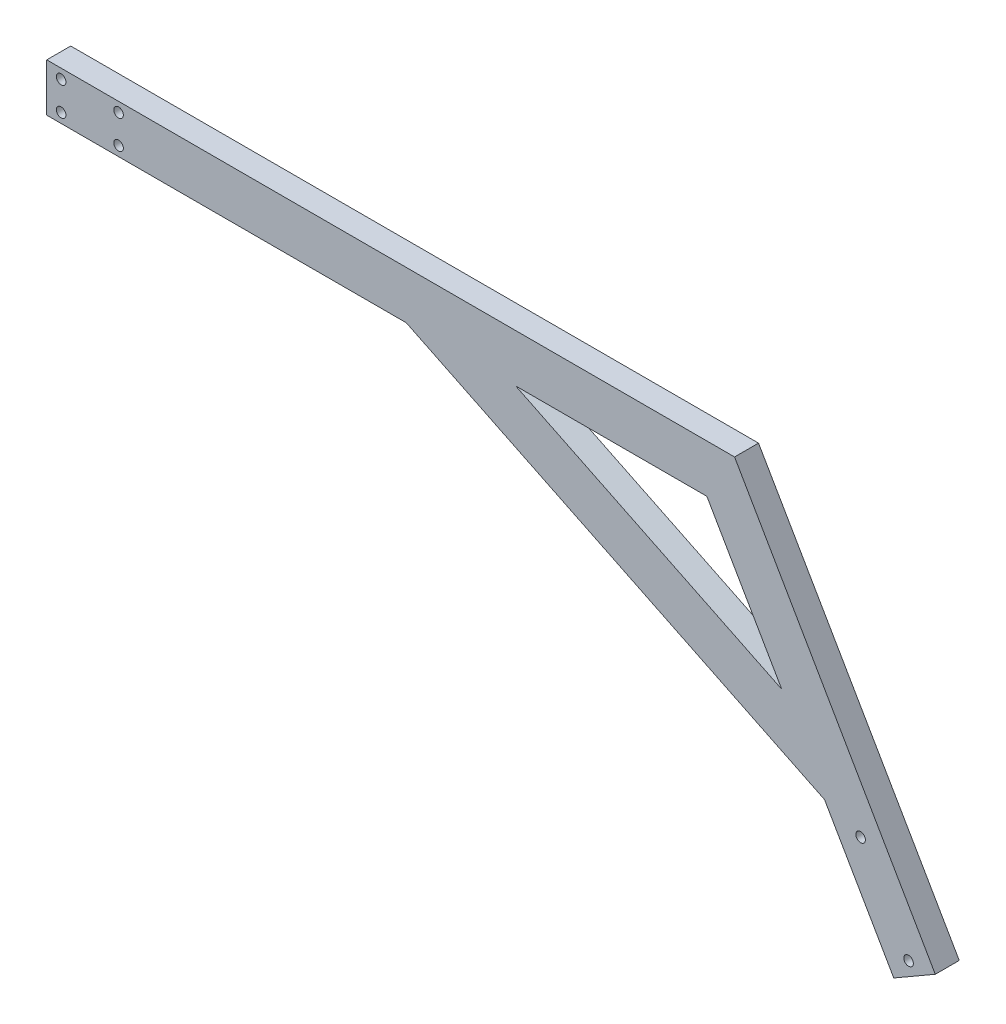
ISO-10303-21;
HEADER;
FILE_DESCRIPTION(('STEP AP214'),'2;1');
FILE_NAME('part.step','',(''),(''),'','','');
FILE_SCHEMA(('AUTOMOTIVE_DESIGN { 1 0 10303 214 1 1 1 1 }'));
ENDSEC;
DATA;
#1=APPLICATION_CONTEXT('core data for automotive mechanical design processes');
#2=APPLICATION_PROTOCOL_DEFINITION('international standard','automotive_design',2000,#1);
#3=PRODUCT_CONTEXT('',#1,'mechanical');
#4=PRODUCT('Part','Part','',(#3));
#5=PRODUCT_RELATED_PRODUCT_CATEGORY('part','',(#4));
#6=PRODUCT_DEFINITION_FORMATION('','',#4);
#7=PRODUCT_DEFINITION_CONTEXT('part definition',#1,'design');
#8=PRODUCT_DEFINITION('design','',#6,#7);
#9=PRODUCT_DEFINITION_SHAPE('','',#8);
#10=(LENGTH_UNIT() NAMED_UNIT(*) SI_UNIT(.MILLI.,.METRE.));
#11=(NAMED_UNIT(*) PLANE_ANGLE_UNIT() SI_UNIT($,.RADIAN.));
#12=(NAMED_UNIT(*) SI_UNIT($,.STERADIAN.) SOLID_ANGLE_UNIT());
#13=UNCERTAINTY_MEASURE_WITH_UNIT(LENGTH_MEASURE(1.E-05),#10,'distance_accuracy_value','');
#14=(GEOMETRIC_REPRESENTATION_CONTEXT(3) GLOBAL_UNCERTAINTY_ASSIGNED_CONTEXT((#13)) GLOBAL_UNIT_ASSIGNED_CONTEXT((#10,
#11,#12)) REPRESENTATION_CONTEXT('',''));
#15=CARTESIAN_POINT('',(0.,0.,0.));
#16=DIRECTION('',(0.,0.,1.));
#17=DIRECTION('',(1.,0.,0.));
#18=AXIS2_PLACEMENT_3D('',#15,#16,#17);
#19=CARTESIAN_POINT('',(0.,0.,10.));
#20=DIRECTION('',(0.,1.,0.));
#21=DIRECTION('',(0.,0.,1.));
#22=AXIS2_PLACEMENT_3D('',#19,#20,#21);
#23=PLANE('',#22);
#24=DIRECTION('',(0.,0.,-1.));
#25=VECTOR('',#24,1.);
#26=CARTESIAN_POINT('',(150.,0.,10.));
#27=LINE('',#26,#25);
#28=CARTESIAN_POINT('',(150.,0.,10.));
#29=VERTEX_POINT('',#28);
#30=CARTESIAN_POINT('',(150.,0.,0.));
#31=VERTEX_POINT('',#30);
#32=EDGE_CURVE('E67',#29,#31,#27,.T.);
#33=ORIENTED_EDGE('',*,*,#32,.F.);
#34=DIRECTION('',(1.,0.,0.));
#35=VECTOR('',#34,1.);
#36=CARTESIAN_POINT('',(0.,0.,10.));
#37=LINE('',#36,#35);
#38=CARTESIAN_POINT('',(0.,0.,10.));
#39=VERTEX_POINT('',#38);
#40=EDGE_CURVE('E221',#39,#29,#37,.T.);
#41=ORIENTED_EDGE('',*,*,#40,.F.);
#42=DIRECTION('',(0.,0.,-1.));
#43=VECTOR('',#42,1.);
#44=CARTESIAN_POINT('',(0.,0.,10.));
#45=LINE('',#44,#43);
#46=CARTESIAN_POINT('',(0.,0.,0.));
#47=VERTEX_POINT('',#46);
#48=EDGE_CURVE('E11',#39,#47,#45,.T.);
#49=ORIENTED_EDGE('',*,*,#48,.T.);
#50=DIRECTION('',(1.,0.,0.));
#51=VECTOR('',#50,1.);
#52=CARTESIAN_POINT('',(0.,0.,0.));
#53=LINE('',#52,#51);
#54=EDGE_CURVE('E135',#47,#31,#53,.T.);
#55=ORIENTED_EDGE('',*,*,#54,.T.);
#56=EDGE_LOOP('',(#33,#41,#49,#55));
#57=FACE_BOUND('',#56,.T.);
#58=ADVANCED_FACE('F43',(#57),#23,.F.);
#59=DIRECTION('',(0.,0.,-1.));
#60=VECTOR('',#59,1.);
#61=CARTESIAN_POINT('',(195.652685925849,0.,10.));
#62=LINE('',#61,#60);
#63=CARTESIAN_POINT('',(195.652685925849,0.,10.));
#64=VERTEX_POINT('',#63);
#65=CARTESIAN_POINT('',(195.652685925849,0.,0.));
#66=VERTEX_POINT('',#65);
#67=EDGE_CURVE('E159',#64,#66,#62,.T.);
#68=ORIENTED_EDGE('',*,*,#67,.T.);
#69=CARTESIAN_POINT('',(275.4,0.,0.));
#70=VERTEX_POINT('',#69);
#71=EDGE_CURVE('E241',#66,#70,#53,.T.);
#72=ORIENTED_EDGE('',*,*,#71,.T.);
#73=DIRECTION('',(0.,0.,-1.));
#74=VECTOR('',#73,1.);
#75=CARTESIAN_POINT('',(275.4,0.,10.));
#76=LINE('',#75,#74);
#77=CARTESIAN_POINT('',(275.4,0.,10.));
#78=VERTEX_POINT('',#77);
#79=EDGE_CURVE('E52',#78,#70,#76,.T.);
#80=ORIENTED_EDGE('',*,*,#79,.F.);
#81=EDGE_CURVE('E59',#64,#78,#37,.T.);
#82=ORIENTED_EDGE('',*,*,#81,.F.);
#83=EDGE_LOOP('',(#68,#72,#80,#82));
#84=FACE_BOUND('',#83,.T.);
#85=ADVANCED_FACE('F313',(#84),#23,.F.);
#86=CARTESIAN_POINT('',(275.4,0.,10.));
#87=DIRECTION('',(0.86602540378444,0.499999999999998,0.));
#88=DIRECTION('',(-0.499999999999998,0.86602540378444,0.));
#89=AXIS2_PLACEMENT_3D('',#86,#87,#88);
#90=PLANE('',#89);
#91=DIRECTION('',(0.,0.,-1.));
#92=VECTOR('',#91,1.);
#93=CARTESIAN_POINT('',(324.498526901566,-85.0411431702995,10.));
#94=LINE('',#93,#92);
#95=CARTESIAN_POINT('',(324.498526901566,-85.0411431702995,10.));
#96=VERTEX_POINT('',#95);
#97=CARTESIAN_POINT('',(324.498526901566,-85.0411431702995,0.));
#98=VERTEX_POINT('',#97);
#99=EDGE_CURVE('E138',#96,#98,#94,.T.);
#100=ORIENTED_EDGE('',*,*,#99,.T.);
#101=DIRECTION('',(0.499999999999998,-0.86602540378444,0.));
#102=VECTOR('',#101,1.);
#103=CARTESIAN_POINT('',(275.4,0.,0.));
#104=LINE('',#103,#102);
#105=CARTESIAN_POINT('',(353.366040361047,-135.0411431703,0.));
#106=VERTEX_POINT('',#105);
#107=EDGE_CURVE('E122',#98,#106,#104,.T.);
#108=ORIENTED_EDGE('',*,*,#107,.T.);
#109=DIRECTION('',(0.,0.,-1.));
#110=VECTOR('',#109,1.);
#111=CARTESIAN_POINT('',(353.366040361047,-135.0411431703,10.));
#112=LINE('',#111,#110);
#113=CARTESIAN_POINT('',(353.366040361047,-135.0411431703,10.));
#114=VERTEX_POINT('',#113);
#115=EDGE_CURVE('E263',#114,#106,#112,.T.);
#116=ORIENTED_EDGE('',*,*,#115,.F.);
#117=DIRECTION('',(0.499999999999998,-0.86602540378444,0.));
#118=VECTOR('',#117,1.);
#119=CARTESIAN_POINT('',(275.4,0.,10.));
#120=LINE('',#119,#118);
#121=EDGE_CURVE('E140',#96,#114,#120,.T.);
#122=ORIENTED_EDGE('',*,*,#121,.F.);
#123=EDGE_LOOP('',(#100,#108,#116,#122));
#124=FACE_BOUND('',#123,.T.);
#125=ADVANCED_FACE('F139',(#124),#90,.F.);
#126=DIRECTION('',(0.,0.,-1.));
#127=VECTOR('',#126,1.);
#128=CARTESIAN_POINT('',(306.623888719277,-54.0813616716643,10.));
#129=LINE('',#128,#127);
#130=CARTESIAN_POINT('',(306.623888719277,-54.0813616716644,10.));
#131=VERTEX_POINT('',#130);
#132=CARTESIAN_POINT('',(306.623888719277,-54.0813616716641,0.));
#133=VERTEX_POINT('',#132);
#134=EDGE_CURVE('E145',#131,#133,#129,.T.);
#135=ORIENTED_EDGE('',*,*,#134,.F.);
#136=EDGE_CURVE('E224',#78,#131,#120,.T.);
#137=ORIENTED_EDGE('',*,*,#136,.F.);
#138=ORIENTED_EDGE('',*,*,#79,.T.);
#139=EDGE_CURVE('E134',#70,#133,#104,.T.);
#140=ORIENTED_EDGE('',*,*,#139,.T.);
#141=EDGE_LOOP('',(#135,#137,#138,#140));
#142=FACE_BOUND('',#141,.T.);
#143=ADVANCED_FACE('F270',(#142),#90,.F.);
#144=CARTESIAN_POINT('',(0.,0.,10.));
#145=DIRECTION('',(0.,0.,1.));
#146=DIRECTION('',(1.,0.,0.));
#147=AXIS2_PLACEMENT_3D('',#144,#145,#146);
#148=PLANE('',#147);
#149=ORIENTED_EDGE('',*,*,#40,.T.);
#150=DIRECTION('',(0.898930958092636,-0.438090324685053,0.));
#151=VECTOR('',#150,1.);
#152=CARTESIAN_POINT('',(150.,0.,10.));
#153=LINE('',#152,#151);
#154=EDGE_CURVE('E153',#29,#96,#153,.T.);
#155=ORIENTED_EDGE('',*,*,#154,.T.);
#156=ORIENTED_EDGE('',*,*,#121,.T.);
#157=DIRECTION('',(0.86602540378444,0.499999999999998,0.));
#158=VECTOR('',#157,1.);
#159=CARTESIAN_POINT('',(353.366040361047,-135.0411431703,10.));
#160=LINE('',#159,#158);
#161=CARTESIAN_POINT('',(370.686548436736,-125.0411431703,10.));
#162=VERTEX_POINT('',#161);
#163=EDGE_CURVE('E228',#114,#162,#160,.T.);
#164=ORIENTED_EDGE('',*,*,#163,.T.);
#165=DIRECTION('',(-0.499999999999999,0.866025403784439,0.));
#166=VECTOR('',#165,1.);
#167=CARTESIAN_POINT('',(370.686548436736,-125.0411431703,10.));
#168=LINE('',#167,#166);
#169=CARTESIAN_POINT('',(286.947005383792,20.,10.));
#170=VERTEX_POINT('',#169);
#171=EDGE_CURVE('E231',#162,#170,#168,.T.);
#172=ORIENTED_EDGE('',*,*,#171,.T.);
#173=DIRECTION('',(-1.,0.,0.));
#174=VECTOR('',#173,1.);
#175=CARTESIAN_POINT('',(286.947005383792,20.,10.));
#176=LINE('',#175,#174);
#177=CARTESIAN_POINT('',(0.,20.,10.));
#178=VERTEX_POINT('',#177);
#179=EDGE_CURVE('E234',#170,#178,#176,.T.);
#180=ORIENTED_EDGE('',*,*,#179,.T.);
#181=DIRECTION('',(0.,-1.,0.));
#182=VECTOR('',#181,1.);
#183=CARTESIAN_POINT('',(0.,20.,10.));
#184=LINE('',#183,#182);
#185=EDGE_CURVE('E216',#178,#39,#184,.T.);
#186=ORIENTED_EDGE('',*,*,#185,.T.);
#187=EDGE_LOOP('',(#149,#155,#156,#164,#172,#180,#186));
#188=FACE_BOUND('',#187,.T.);
#189=CARTESIAN_POINT('',(339.526294398891,-91.07,10.));
#190=DIRECTION('',(0.,0.,1.));
#191=DIRECTION('',(1.,0.,0.));
#192=AXIS2_PLACEMENT_3D('',#189,#190,#191);
#193=CIRCLE('',#192,2.);
#194=CARTESIAN_POINT('',(341.526294398891,-91.07,10.));
#195=VERTEX_POINT('',#194);
#196=EDGE_CURVE('E176',#195,#195,#193,.T.);
#197=ORIENTED_EDGE('',*,*,#196,.F.);
#198=EDGE_LOOP('',(#197));
#199=FACE_BOUND('',#198,.T.);
#200=CARTESIAN_POINT('',(29.96,4.02,10.));
#201=DIRECTION('',(0.,0.,1.));
#202=DIRECTION('',(1.,0.,0.));
#203=AXIS2_PLACEMENT_3D('',#200,#201,#202);
#204=CIRCLE('',#203,2.00000000000001);
#205=CARTESIAN_POINT('',(31.96,4.02,10.));
#206=VERTEX_POINT('',#205);
#207=EDGE_CURVE('E192',#206,#206,#204,.T.);
#208=ORIENTED_EDGE('',*,*,#207,.F.);
#209=EDGE_LOOP('',(#208));
#210=FACE_BOUND('',#209,.T.);
#211=CARTESIAN_POINT('',(6.,15.98,10.));
#212=DIRECTION('',(0.,0.,1.));
#213=DIRECTION('',(1.,0.,0.));
#214=AXIS2_PLACEMENT_3D('',#211,#212,#213);
#215=CIRCLE('',#214,2.);
#216=CARTESIAN_POINT('',(8.,15.98,10.));
#217=VERTEX_POINT('',#216);
#218=EDGE_CURVE('E208',#217,#217,#215,.T.);
#219=ORIENTED_EDGE('',*,*,#218,.F.);
#220=EDGE_LOOP('',(#219));
#221=FACE_BOUND('',#220,.T.);
#222=DIRECTION('',(-0.898930958092636,0.438090324685053,0.));
#223=VECTOR('',#222,1.);
#224=CARTESIAN_POINT('',(195.652685925849,0.,10.));
#225=LINE('',#224,#223);
#226=EDGE_CURVE('E156',#131,#64,#225,.T.);
#227=ORIENTED_EDGE('',*,*,#226,.T.);
#228=ORIENTED_EDGE('',*,*,#81,.T.);
#229=ORIENTED_EDGE('',*,*,#136,.T.);
#230=EDGE_LOOP('',(#227,#228,#229));
#231=FACE_BOUND('',#230,.T.);
#232=CARTESIAN_POINT('',(29.96,15.98,10.));
#233=DIRECTION('',(0.,0.,1.));
#234=DIRECTION('',(1.,0.,0.));
#235=AXIS2_PLACEMENT_3D('',#232,#233,#234);
#236=CIRCLE('',#235,2.00000000000001);
#237=CARTESIAN_POINT('',(31.96,15.98,10.));
#238=VERTEX_POINT('',#237);
#239=EDGE_CURVE('E200',#238,#238,#236,.T.);
#240=ORIENTED_EDGE('',*,*,#239,.F.);
#241=EDGE_LOOP('',(#240));
#242=FACE_BOUND('',#241,.T.);
#243=CARTESIAN_POINT('',(6.,4.02,10.));
#244=DIRECTION('',(0.,0.,1.));
#245=DIRECTION('',(1.,0.,0.));
#246=AXIS2_PLACEMENT_3D('',#243,#244,#245);
#247=CIRCLE('',#246,2.);
#248=CARTESIAN_POINT('',(8.,4.02,10.));
#249=VERTEX_POINT('',#248);
#250=EDGE_CURVE('E184',#249,#249,#247,.T.);
#251=ORIENTED_EDGE('',*,*,#250,.F.);
#252=EDGE_LOOP('',(#251));
#253=FACE_BOUND('',#252,.T.);
#254=CARTESIAN_POINT('',(359.526294398891,-125.711016151378,10.));
#255=DIRECTION('',(0.,0.,1.));
#256=DIRECTION('',(1.,0.,0.));
#257=AXIS2_PLACEMENT_3D('',#254,#255,#256);
#258=CIRCLE('',#257,1.99999999999971);
#259=CARTESIAN_POINT('',(361.526294398891,-125.711016151378,10.));
#260=VERTEX_POINT('',#259);
#261=EDGE_CURVE('E168',#260,#260,#258,.T.);
#262=ORIENTED_EDGE('',*,*,#261,.F.);
#263=EDGE_LOOP('',(#262));
#264=FACE_BOUND('',#263,.T.);
#265=ADVANCED_FACE('F278',(#188,#199,#210,#221,#231,#242,#253,#264),#148,.T.);
#266=CARTESIAN_POINT('',(0.,0.,0.));
#267=DIRECTION('',(0.,0.,1.));
#268=DIRECTION('',(1.,0.,0.));
#269=AXIS2_PLACEMENT_3D('',#266,#267,#268);
#270=PLANE('',#269);
#271=DIRECTION('',(0.898930958092636,-0.438090324685053,0.));
#272=VECTOR('',#271,1.);
#273=CARTESIAN_POINT('',(150.,0.,0.));
#274=LINE('',#273,#272);
#275=EDGE_CURVE('E127',#31,#98,#274,.T.);
#276=ORIENTED_EDGE('',*,*,#275,.F.);
#277=ORIENTED_EDGE('',*,*,#54,.F.);
#278=DIRECTION('',(0.,-1.,0.));
#279=VECTOR('',#278,1.);
#280=CARTESIAN_POINT('',(0.,20.,0.));
#281=LINE('',#280,#279);
#282=CARTESIAN_POINT('',(0.,20.,0.));
#283=VERTEX_POINT('',#282);
#284=EDGE_CURVE('E212',#283,#47,#281,.T.);
#285=ORIENTED_EDGE('',*,*,#284,.F.);
#286=DIRECTION('',(-1.,0.,0.));
#287=VECTOR('',#286,1.);
#288=CARTESIAN_POINT('',(286.947005383792,20.,0.));
#289=LINE('',#288,#287);
#290=CARTESIAN_POINT('',(286.947005383792,20.,0.));
#291=VERTEX_POINT('',#290);
#292=EDGE_CURVE('E220',#291,#283,#289,.T.);
#293=ORIENTED_EDGE('',*,*,#292,.F.);
#294=DIRECTION('',(-0.499999999999999,0.866025403784439,0.));
#295=VECTOR('',#294,1.);
#296=CARTESIAN_POINT('',(370.686548436736,-125.0411431703,0.));
#297=LINE('',#296,#295);
#298=CARTESIAN_POINT('',(370.686548436736,-125.0411431703,0.));
#299=VERTEX_POINT('',#298);
#300=EDGE_CURVE('E247',#299,#291,#297,.T.);
#301=ORIENTED_EDGE('',*,*,#300,.F.);
#302=DIRECTION('',(0.86602540378444,0.499999999999998,0.));
#303=VECTOR('',#302,1.);
#304=CARTESIAN_POINT('',(353.366040361047,-135.0411431703,0.));
#305=LINE('',#304,#303);
#306=EDGE_CURVE('E129',#106,#299,#305,.T.);
#307=ORIENTED_EDGE('',*,*,#306,.F.);
#308=ORIENTED_EDGE('',*,*,#107,.F.);
#309=EDGE_LOOP('',(#276,#277,#285,#293,#301,#307,#308));
#310=FACE_BOUND('',#309,.T.);
#311=ORIENTED_EDGE('',*,*,#71,.F.);
#312=DIRECTION('',(-0.898930958092636,0.438090324685053,0.));
#313=VECTOR('',#312,1.);
#314=CARTESIAN_POINT('',(195.652685925849,0.,0.));
#315=LINE('',#314,#313);
#316=EDGE_CURVE('E149',#133,#66,#315,.T.);
#317=ORIENTED_EDGE('',*,*,#316,.F.);
#318=ORIENTED_EDGE('',*,*,#139,.F.);
#319=EDGE_LOOP('',(#311,#317,#318));
#320=FACE_BOUND('',#319,.T.);
#321=CARTESIAN_POINT('',(6.,15.98,0.));
#322=DIRECTION('',(0.,0.,1.));
#323=DIRECTION('',(1.,0.,0.));
#324=AXIS2_PLACEMENT_3D('',#321,#322,#323);
#325=CIRCLE('',#324,2.);
#326=CARTESIAN_POINT('',(8.,15.98,0.));
#327=VERTEX_POINT('',#326);
#328=EDGE_CURVE('E204',#327,#327,#325,.T.);
#329=ORIENTED_EDGE('',*,*,#328,.T.);
#330=EDGE_LOOP('',(#329));
#331=FACE_BOUND('',#330,.T.);
#332=CARTESIAN_POINT('',(29.96,15.98,0.));
#333=DIRECTION('',(0.,0.,1.));
#334=DIRECTION('',(1.,0.,0.));
#335=AXIS2_PLACEMENT_3D('',#332,#333,#334);
#336=CIRCLE('',#335,2.00000000000001);
#337=CARTESIAN_POINT('',(31.96,15.98,0.));
#338=VERTEX_POINT('',#337);
#339=EDGE_CURVE('E196',#338,#338,#336,.T.);
#340=ORIENTED_EDGE('',*,*,#339,.T.);
#341=EDGE_LOOP('',(#340));
#342=FACE_BOUND('',#341,.T.);
#343=CARTESIAN_POINT('',(29.96,4.02,0.));
#344=DIRECTION('',(0.,0.,1.));
#345=DIRECTION('',(1.,0.,0.));
#346=AXIS2_PLACEMENT_3D('',#343,#344,#345);
#347=CIRCLE('',#346,2.00000000000001);
#348=CARTESIAN_POINT('',(31.96,4.02,0.));
#349=VERTEX_POINT('',#348);
#350=EDGE_CURVE('E188',#349,#349,#347,.T.);
#351=ORIENTED_EDGE('',*,*,#350,.T.);
#352=EDGE_LOOP('',(#351));
#353=FACE_BOUND('',#352,.T.);
#354=CARTESIAN_POINT('',(6.,4.02,0.));
#355=DIRECTION('',(0.,0.,1.));
#356=DIRECTION('',(1.,0.,0.));
#357=AXIS2_PLACEMENT_3D('',#354,#355,#356);
#358=CIRCLE('',#357,2.);
#359=CARTESIAN_POINT('',(8.,4.02,0.));
#360=VERTEX_POINT('',#359);
#361=EDGE_CURVE('E180',#360,#360,#358,.T.);
#362=ORIENTED_EDGE('',*,*,#361,.T.);
#363=EDGE_LOOP('',(#362));
#364=FACE_BOUND('',#363,.T.);
#365=CARTESIAN_POINT('',(339.526294398891,-91.07,0.));
#366=DIRECTION('',(0.,0.,1.));
#367=DIRECTION('',(1.,0.,0.));
#368=AXIS2_PLACEMENT_3D('',#365,#366,#367);
#369=CIRCLE('',#368,2.);
#370=CARTESIAN_POINT('',(341.526294398891,-91.07,0.));
#371=VERTEX_POINT('',#370);
#372=EDGE_CURVE('E172',#371,#371,#369,.T.);
#373=ORIENTED_EDGE('',*,*,#372,.T.);
#374=EDGE_LOOP('',(#373));
#375=FACE_BOUND('',#374,.T.);
#376=CARTESIAN_POINT('',(359.526294398891,-125.711016151378,0.));
#377=DIRECTION('',(0.,0.,1.));
#378=DIRECTION('',(1.,0.,0.));
#379=AXIS2_PLACEMENT_3D('',#376,#377,#378);
#380=CIRCLE('',#379,1.99999999999971);
#381=CARTESIAN_POINT('',(361.526294398891,-125.711016151378,0.));
#382=VERTEX_POINT('',#381);
#383=EDGE_CURVE('E167',#382,#382,#380,.T.);
#384=ORIENTED_EDGE('',*,*,#383,.T.);
#385=EDGE_LOOP('',(#384));
#386=FACE_BOUND('',#385,.T.);
#387=ADVANCED_FACE('F124',(#310,#320,#331,#342,#353,#364,#375,#386),#270,.F.);
#388=CARTESIAN_POINT('',(0.,20.,10.));
#389=DIRECTION('',(1.,0.,0.));
#390=DIRECTION('',(0.,0.,-1.));
#391=AXIS2_PLACEMENT_3D('',#388,#389,#390);
#392=PLANE('',#391);
#393=ORIENTED_EDGE('',*,*,#284,.T.);
#394=ORIENTED_EDGE('',*,*,#48,.F.);
#395=ORIENTED_EDGE('',*,*,#185,.F.);
#396=DIRECTION('',(0.,0.,-1.));
#397=VECTOR('',#396,1.);
#398=CARTESIAN_POINT('',(0.,20.,10.));
#399=LINE('',#398,#397);
#400=EDGE_CURVE('E237',#178,#283,#399,.T.);
#401=ORIENTED_EDGE('',*,*,#400,.T.);
#402=EDGE_LOOP('',(#393,#394,#395,#401));
#403=FACE_BOUND('',#402,.T.);
#404=ADVANCED_FACE('F45',(#403),#392,.F.);
#405=CARTESIAN_POINT('',(353.366040361047,-135.0411431703,10.));
#406=DIRECTION('',(-0.499999999999997,0.86602540378444,0.));
#407=DIRECTION('',(-0.86602540378444,-0.499999999999998,0.));
#408=AXIS2_PLACEMENT_3D('',#405,#406,#407);
#409=PLANE('',#408);
#410=ORIENTED_EDGE('',*,*,#306,.T.);
#411=DIRECTION('',(0.,0.,-1.));
#412=VECTOR('',#411,1.);
#413=CARTESIAN_POINT('',(370.686548436736,-125.0411431703,10.));
#414=LINE('',#413,#412);
#415=EDGE_CURVE('E259',#162,#299,#414,.T.);
#416=ORIENTED_EDGE('',*,*,#415,.F.);
#417=ORIENTED_EDGE('',*,*,#163,.F.);
#418=ORIENTED_EDGE('',*,*,#115,.T.);
#419=EDGE_LOOP('',(#410,#416,#417,#418));
#420=FACE_BOUND('',#419,.T.);
#421=ADVANCED_FACE('F303',(#420),#409,.F.);
#422=CARTESIAN_POINT('',(370.686548436736,-125.0411431703,10.));
#423=DIRECTION('',(-0.866025403784439,-0.499999999999999,0.));
#424=DIRECTION('',(0.499999999999999,-0.866025403784439,0.));
#425=AXIS2_PLACEMENT_3D('',#422,#423,#424);
#426=PLANE('',#425);
#427=ORIENTED_EDGE('',*,*,#300,.T.);
#428=DIRECTION('',(0.,0.,-1.));
#429=VECTOR('',#428,1.);
#430=CARTESIAN_POINT('',(286.947005383792,20.,10.));
#431=LINE('',#430,#429);
#432=EDGE_CURVE('E255',#170,#291,#431,.T.);
#433=ORIENTED_EDGE('',*,*,#432,.F.);
#434=ORIENTED_EDGE('',*,*,#171,.F.);
#435=ORIENTED_EDGE('',*,*,#415,.T.);
#436=EDGE_LOOP('',(#427,#433,#434,#435));
#437=FACE_BOUND('',#436,.T.);
#438=ADVANCED_FACE('F299',(#437),#426,.F.);
#439=CARTESIAN_POINT('',(286.947005383792,20.,10.));
#440=DIRECTION('',(0.,-1.,0.));
#441=DIRECTION('',(0.,0.,-1.));
#442=AXIS2_PLACEMENT_3D('',#439,#440,#441);
#443=PLANE('',#442);
#444=ORIENTED_EDGE('',*,*,#292,.T.);
#445=ORIENTED_EDGE('',*,*,#400,.F.);
#446=ORIENTED_EDGE('',*,*,#179,.F.);
#447=ORIENTED_EDGE('',*,*,#432,.T.);
#448=EDGE_LOOP('',(#444,#445,#446,#447));
#449=FACE_BOUND('',#448,.T.);
#450=ADVANCED_FACE('F294',(#449),#443,.F.);
#451=CARTESIAN_POINT('',(6.,15.98,10.));
#452=DIRECTION('',(0.,0.,-1.));
#453=DIRECTION('',(-1.,0.,0.));
#454=AXIS2_PLACEMENT_3D('',#451,#452,#453);
#455=CYLINDRICAL_SURFACE('',#454,2.);
#456=ORIENTED_EDGE('',*,*,#218,.T.);
#457=EDGE_LOOP('',(#456));
#458=FACE_BOUND('',#457,.T.);
#459=ORIENTED_EDGE('',*,*,#328,.F.);
#460=EDGE_LOOP('',(#459));
#461=FACE_BOUND('',#460,.T.);
#462=ADVANCED_FACE('F332',(#458,#461),#455,.F.);
#463=CARTESIAN_POINT('',(29.96,15.98,10.));
#464=DIRECTION('',(0.,0.,-1.));
#465=DIRECTION('',(-1.,0.,0.));
#466=AXIS2_PLACEMENT_3D('',#463,#464,#465);
#467=CYLINDRICAL_SURFACE('',#466,2.00000000000001);
#468=ORIENTED_EDGE('',*,*,#239,.T.);
#469=EDGE_LOOP('',(#468));
#470=FACE_BOUND('',#469,.T.);
#471=ORIENTED_EDGE('',*,*,#339,.F.);
#472=EDGE_LOOP('',(#471));
#473=FACE_BOUND('',#472,.T.);
#474=ADVANCED_FACE('F339',(#470,#473),#467,.F.);
#475=CARTESIAN_POINT('',(29.96,4.02,10.));
#476=DIRECTION('',(0.,0.,-1.));
#477=DIRECTION('',(-1.,0.,0.));
#478=AXIS2_PLACEMENT_3D('',#475,#476,#477);
#479=CYLINDRICAL_SURFACE('',#478,2.00000000000001);
#480=ORIENTED_EDGE('',*,*,#207,.T.);
#481=EDGE_LOOP('',(#480));
#482=FACE_BOUND('',#481,.T.);
#483=ORIENTED_EDGE('',*,*,#350,.F.);
#484=EDGE_LOOP('',(#483));
#485=FACE_BOUND('',#484,.T.);
#486=ADVANCED_FACE('F344',(#482,#485),#479,.F.);
#487=CARTESIAN_POINT('',(6.,4.02,10.));
#488=DIRECTION('',(0.,0.,-1.));
#489=DIRECTION('',(-1.,0.,0.));
#490=AXIS2_PLACEMENT_3D('',#487,#488,#489);
#491=CYLINDRICAL_SURFACE('',#490,2.);
#492=ORIENTED_EDGE('',*,*,#250,.T.);
#493=EDGE_LOOP('',(#492));
#494=FACE_BOUND('',#493,.T.);
#495=ORIENTED_EDGE('',*,*,#361,.F.);
#496=EDGE_LOOP('',(#495));
#497=FACE_BOUND('',#496,.T.);
#498=ADVANCED_FACE('F370',(#494,#497),#491,.F.);
#499=CARTESIAN_POINT('',(339.526294398891,-91.07,10.));
#500=DIRECTION('',(0.,0.,-1.));
#501=DIRECTION('',(-1.,0.,0.));
#502=AXIS2_PLACEMENT_3D('',#499,#500,#501);
#503=CYLINDRICAL_SURFACE('',#502,2.);
#504=ORIENTED_EDGE('',*,*,#196,.T.);
#505=EDGE_LOOP('',(#504));
#506=FACE_BOUND('',#505,.T.);
#507=ORIENTED_EDGE('',*,*,#372,.F.);
#508=EDGE_LOOP('',(#507));
#509=FACE_BOUND('',#508,.T.);
#510=ADVANCED_FACE('F362',(#506,#509),#503,.F.);
#511=CARTESIAN_POINT('',(359.526294398891,-125.711016151378,10.));
#512=DIRECTION('',(0.,0.,-1.));
#513=DIRECTION('',(-1.,0.,0.));
#514=AXIS2_PLACEMENT_3D('',#511,#512,#513);
#515=CYLINDRICAL_SURFACE('',#514,1.99999999999971);
#516=ORIENTED_EDGE('',*,*,#261,.T.);
#517=EDGE_LOOP('',(#516));
#518=FACE_BOUND('',#517,.T.);
#519=ORIENTED_EDGE('',*,*,#383,.F.);
#520=EDGE_LOOP('',(#519));
#521=FACE_BOUND('',#520,.T.);
#522=ADVANCED_FACE('F360',(#518,#521),#515,.F.);
#523=CARTESIAN_POINT('',(150.,0.,10.));
#524=DIRECTION('',(0.438090324685053,0.898930958092637,0.));
#525=DIRECTION('',(-0.898930958092636,0.438090324685053,0.));
#526=AXIS2_PLACEMENT_3D('',#523,#524,#525);
#527=PLANE('',#526);
#528=ORIENTED_EDGE('',*,*,#275,.T.);
#529=ORIENTED_EDGE('',*,*,#99,.F.);
#530=ORIENTED_EDGE('',*,*,#154,.F.);
#531=ORIENTED_EDGE('',*,*,#32,.T.);
#532=EDGE_LOOP('',(#528,#529,#530,#531));
#533=FACE_BOUND('',#532,.T.);
#534=ADVANCED_FACE('F147',(#533),#527,.F.);
#535=CARTESIAN_POINT('',(195.652685925849,0.,10.));
#536=DIRECTION('',(-0.438090324685053,-0.898930958092637,0.));
#537=DIRECTION('',(0.898930958092636,-0.438090324685053,0.));
#538=AXIS2_PLACEMENT_3D('',#535,#536,#537);
#539=PLANE('',#538);
#540=ORIENTED_EDGE('',*,*,#316,.T.);
#541=ORIENTED_EDGE('',*,*,#67,.F.);
#542=ORIENTED_EDGE('',*,*,#226,.F.);
#543=ORIENTED_EDGE('',*,*,#134,.T.);
#544=EDGE_LOOP('',(#540,#541,#542,#543));
#545=FACE_BOUND('',#544,.T.);
#546=ADVANCED_FACE('F275',(#545),#539,.F.);
#547=CLOSED_SHELL('',(#58,#85,#125,#143,#265,#387,#404,#421,#438,#450,#462,#474,#486,#498,#510,
#522,#534,#546));
#548=MANIFOLD_SOLID_BREP('B2',#547);
#549=ADVANCED_BREP_SHAPE_REPRESENTATION('',(#18,#548),#14);
#550=SHAPE_DEFINITION_REPRESENTATION(#9,#549);
ENDSEC;
END-ISO-10303-21;
